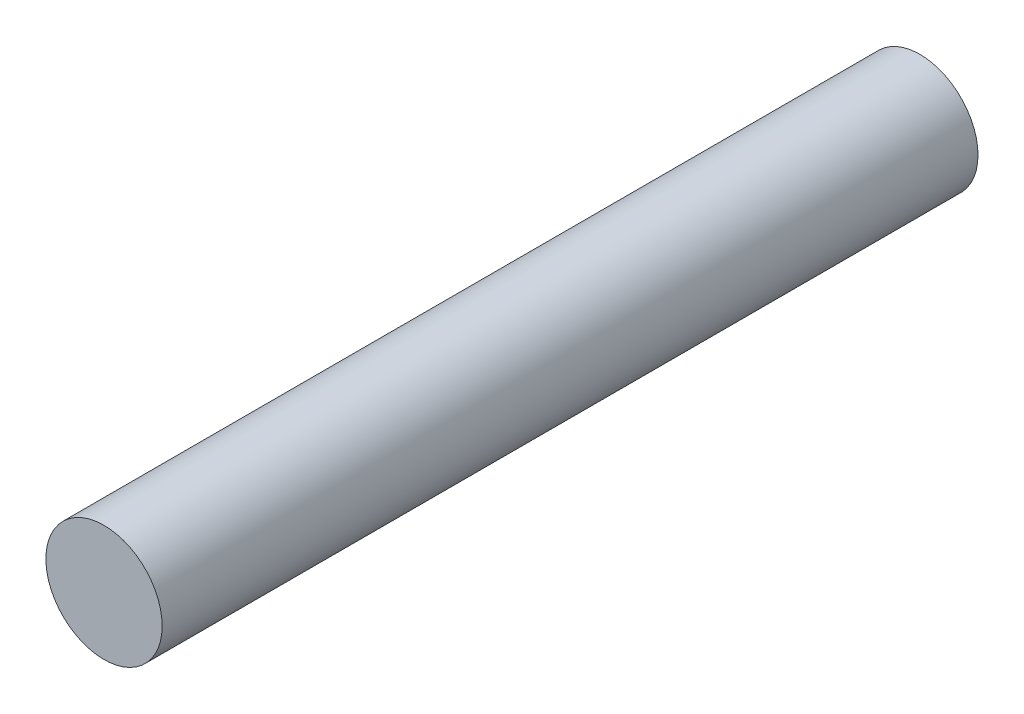
ISO-10303-21;
HEADER;
FILE_DESCRIPTION(('STEP AP214'),'2;1');
FILE_NAME('part.step','',(''),(''),'','','');
FILE_SCHEMA(('AUTOMOTIVE_DESIGN { 1 0 10303 214 1 1 1 1 }'));
ENDSEC;
DATA;
#1=APPLICATION_CONTEXT('core data for automotive mechanical design processes');
#2=APPLICATION_PROTOCOL_DEFINITION('international standard','automotive_design',2000,#1);
#3=PRODUCT_CONTEXT('',#1,'mechanical');
#4=PRODUCT('Part','Part','',(#3));
#5=PRODUCT_RELATED_PRODUCT_CATEGORY('part','',(#4));
#6=PRODUCT_DEFINITION_FORMATION('','',#4);
#7=PRODUCT_DEFINITION_CONTEXT('part definition',#1,'design');
#8=PRODUCT_DEFINITION('design','',#6,#7);
#9=PRODUCT_DEFINITION_SHAPE('','',#8);
#10=(LENGTH_UNIT() NAMED_UNIT(*) SI_UNIT(.MILLI.,.METRE.));
#11=(NAMED_UNIT(*) PLANE_ANGLE_UNIT() SI_UNIT($,.RADIAN.));
#12=(NAMED_UNIT(*) SI_UNIT($,.STERADIAN.) SOLID_ANGLE_UNIT());
#13=UNCERTAINTY_MEASURE_WITH_UNIT(LENGTH_MEASURE(1.E-05),#10,'distance_accuracy_value','');
#14=(GEOMETRIC_REPRESENTATION_CONTEXT(3) GLOBAL_UNCERTAINTY_ASSIGNED_CONTEXT((#13)) GLOBAL_UNIT_ASSIGNED_CONTEXT((#10,
#11,#12)) REPRESENTATION_CONTEXT('',''));
#15=CARTESIAN_POINT('',(0.,0.,0.));
#16=DIRECTION('',(0.,0.,1.));
#17=DIRECTION('',(1.,0.,0.));
#18=AXIS2_PLACEMENT_3D('',#15,#16,#17);
#19=CARTESIAN_POINT('',(0.,0.,40.));
#20=DIRECTION('',(0.,0.,-1.));
#21=DIRECTION('',(-1.,0.,0.));
#22=AXIS2_PLACEMENT_3D('',#19,#20,#21);
#23=CYLINDRICAL_SURFACE('',#22,2.85);
#24=CARTESIAN_POINT('',(0.,0.,40.));
#25=DIRECTION('',(0.,0.,1.));
#26=DIRECTION('',(1.,0.,0.));
#27=AXIS2_PLACEMENT_3D('',#24,#25,#26);
#28=CIRCLE('',#27,2.85);
#29=CARTESIAN_POINT('',(2.85,0.,40.));
#30=VERTEX_POINT('',#29);
#31=EDGE_CURVE('E10',#30,#30,#28,.T.);
#32=ORIENTED_EDGE('',*,*,#31,.F.);
#33=EDGE_LOOP('',(#32));
#34=FACE_BOUND('',#33,.T.);
#35=CARTESIAN_POINT('',(0.,0.,0.));
#36=DIRECTION('',(0.,0.,1.));
#37=DIRECTION('',(1.,0.,0.));
#38=AXIS2_PLACEMENT_3D('',#35,#36,#37);
#39=CIRCLE('',#38,2.85);
#40=CARTESIAN_POINT('',(2.85,0.,0.));
#41=VERTEX_POINT('',#40);
#42=EDGE_CURVE('E40',#41,#41,#39,.T.);
#43=ORIENTED_EDGE('',*,*,#42,.T.);
#44=EDGE_LOOP('',(#43));
#45=FACE_BOUND('',#44,.T.);
#46=ADVANCED_FACE('F37',(#34,#45),#23,.T.);
#47=CARTESIAN_POINT('',(0.,0.,40.));
#48=DIRECTION('',(0.,0.,1.));
#49=DIRECTION('',(1.,0.,0.));
#50=AXIS2_PLACEMENT_3D('',#47,#48,#49);
#51=PLANE('',#50);
#52=ORIENTED_EDGE('',*,*,#31,.T.);
#53=EDGE_LOOP('',(#52));
#54=FACE_BOUND('',#53,.T.);
#55=ADVANCED_FACE('F54',(#54),#51,.T.);
#56=CARTESIAN_POINT('',(0.,0.,0.));
#57=DIRECTION('',(0.,0.,1.));
#58=DIRECTION('',(1.,0.,0.));
#59=AXIS2_PLACEMENT_3D('',#56,#57,#58);
#60=PLANE('',#59);
#61=ORIENTED_EDGE('',*,*,#42,.F.);
#62=EDGE_LOOP('',(#61));
#63=FACE_BOUND('',#62,.T.);
#64=ADVANCED_FACE('F52',(#63),#60,.F.);
#65=CLOSED_SHELL('',(#46,#55,#64));
#66=MANIFOLD_SOLID_BREP('B2',#65);
#67=ADVANCED_BREP_SHAPE_REPRESENTATION('',(#18,#66),#14);
#68=SHAPE_DEFINITION_REPRESENTATION(#9,#67);
ENDSEC;
END-ISO-10303-21;
